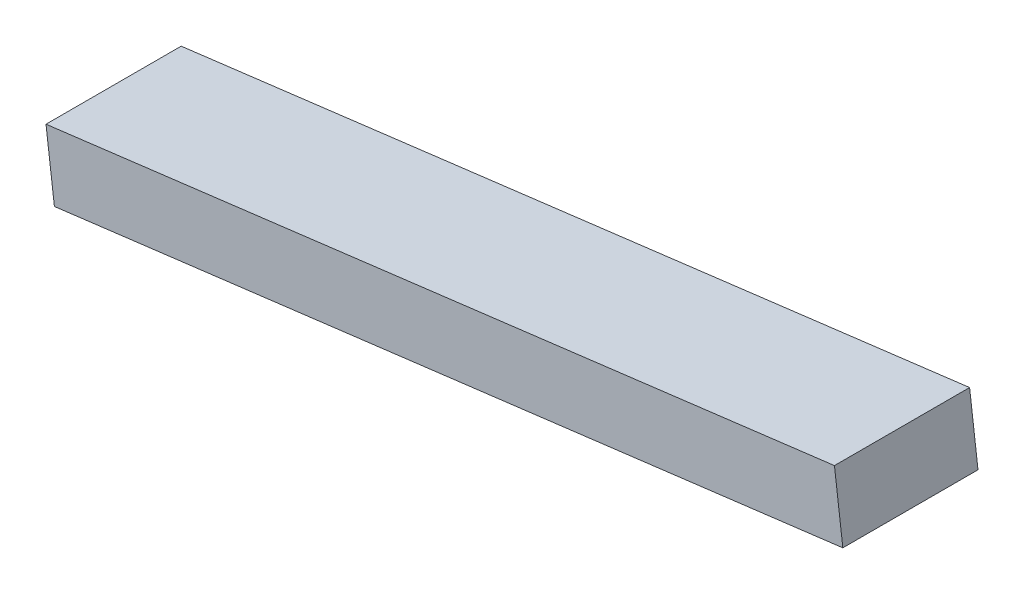
ISO-10303-21;
HEADER;
FILE_DESCRIPTION(('STEP AP214'),'2;1');
FILE_NAME('part.step','',(''),(''),'','','');
FILE_SCHEMA(('AUTOMOTIVE_DESIGN { 1 0 10303 214 1 1 1 1 }'));
ENDSEC;
DATA;
#1=APPLICATION_CONTEXT('core data for automotive mechanical design processes');
#2=APPLICATION_PROTOCOL_DEFINITION('international standard','automotive_design',2000,#1);
#3=PRODUCT_CONTEXT('',#1,'mechanical');
#4=PRODUCT('Part','Part','',(#3));
#5=PRODUCT_RELATED_PRODUCT_CATEGORY('part','',(#4));
#6=PRODUCT_DEFINITION_FORMATION('','',#4);
#7=PRODUCT_DEFINITION_CONTEXT('part definition',#1,'design');
#8=PRODUCT_DEFINITION('design','',#6,#7);
#9=PRODUCT_DEFINITION_SHAPE('','',#8);
#10=(LENGTH_UNIT() NAMED_UNIT(*) SI_UNIT(.MILLI.,.METRE.));
#11=(NAMED_UNIT(*) PLANE_ANGLE_UNIT() SI_UNIT($,.RADIAN.));
#12=(NAMED_UNIT(*) SI_UNIT($,.STERADIAN.) SOLID_ANGLE_UNIT());
#13=UNCERTAINTY_MEASURE_WITH_UNIT(LENGTH_MEASURE(1.E-05),#10,'distance_accuracy_value','');
#14=(GEOMETRIC_REPRESENTATION_CONTEXT(3) GLOBAL_UNCERTAINTY_ASSIGNED_CONTEXT((#13)) GLOBAL_UNIT_ASSIGNED_CONTEXT((#10,
#11,#12)) REPRESENTATION_CONTEXT('',''));
#15=CARTESIAN_POINT('',(0.,0.,0.));
#16=DIRECTION('',(0.,0.,1.));
#17=DIRECTION('',(1.,0.,0.));
#18=AXIS2_PLACEMENT_3D('',#15,#16,#17);
#19=CARTESIAN_POINT('',(368.571015472579,25.8277068433039,636.696489798407));
#20=DIRECTION('',(0.124068164170064,-0.992273697444143,0.));
#21=DIRECTION('',(0.992273697444143,0.124068164170064,0.));
#22=AXIS2_PLACEMENT_3D('',#19,#20,#21);
#23=PLANE('',#22);
#24=DIRECTION('',(-0.992273697444143,-0.124068164170064,0.));
#25=VECTOR('',#24,1.);
#26=CARTESIAN_POINT('',(368.571015472579,25.8277068433039,636.696489798407));
#27=LINE('',#26,#25);
#28=CARTESIAN_POINT('',(367.562865395976,25.7016535885072,636.696489798407));
#29=VERTEX_POINT('',#28);
#30=CARTESIAN_POINT('',(293.480518874116,16.4388254453726,636.696489798407));
#31=VERTEX_POINT('',#30);
#32=EDGE_CURVE('E87',#29,#31,#27,.T.);
#33=ORIENTED_EDGE('',*,*,#32,.T.);
#34=DIRECTION('',(0.,0.,1.));
#35=VECTOR('',#34,1.);
#36=CARTESIAN_POINT('',(293.480518874116,16.4388254453726,636.696489798407));
#37=LINE('',#36,#35);
#38=CARTESIAN_POINT('',(293.480518874116,16.4388254453726,649.396489798407));
#39=VERTEX_POINT('',#38);
#40=EDGE_CURVE('E43',#31,#39,#37,.T.);
#41=ORIENTED_EDGE('',*,*,#40,.T.);
#42=DIRECTION('',(-0.992273697444143,-0.124068164170064,0.));
#43=VECTOR('',#42,1.);
#44=CARTESIAN_POINT('',(368.571015472579,25.8277068433039,649.396489798407));
#45=LINE('',#44,#43);
#46=CARTESIAN_POINT('',(367.562865395976,25.7016535885072,649.396489798407));
#47=VERTEX_POINT('',#46);
#48=EDGE_CURVE('E78',#47,#39,#45,.T.);
#49=ORIENTED_EDGE('',*,*,#48,.F.);
#50=DIRECTION('',(0.,0.,1.));
#51=VECTOR('',#50,1.);
#52=CARTESIAN_POINT('',(367.562865395976,25.7016535885072,636.696489798407));
#53=LINE('',#52,#51);
#54=EDGE_CURVE('E91',#29,#47,#53,.T.);
#55=ORIENTED_EDGE('',*,*,#54,.F.);
#56=EDGE_LOOP('',(#33,#41,#49,#55));
#57=FACE_BOUND('',#56,.T.);
#58=ADVANCED_FACE('F35',(#57),#23,.F.);
#59=CARTESIAN_POINT('',(293.480518874116,16.4388254453726,636.696489798407));
#60=DIRECTION('',(0.992273697444144,0.124068164170055,0.));
#61=DIRECTION('',(-0.124068164170055,0.992273697444144,0.));
#62=AXIS2_PLACEMENT_3D('',#59,#60,#61);
#63=PLANE('',#62);
#64=DIRECTION('',(0.124068164170055,-0.992273697444144,0.));
#65=VECTOR('',#64,1.);
#66=CARTESIAN_POINT('',(293.480518874116,16.4388254453726,649.396489798407));
#67=LINE('',#66,#65);
#68=CARTESIAN_POINT('',(294.268351716596,10.1378874666023,649.396489798407));
#69=VERTEX_POINT('',#68);
#70=EDGE_CURVE('E70',#39,#69,#67,.T.);
#71=ORIENTED_EDGE('',*,*,#70,.F.);
#72=ORIENTED_EDGE('',*,*,#40,.F.);
#73=DIRECTION('',(0.124068164170055,-0.992273697444144,0.));
#74=VECTOR('',#73,1.);
#75=CARTESIAN_POINT('',(293.480518874116,16.4388254453726,636.696489798407));
#76=LINE('',#75,#74);
#77=CARTESIAN_POINT('',(294.268351716596,10.1378874666023,636.696489798407));
#78=VERTEX_POINT('',#77);
#79=EDGE_CURVE('E57',#31,#78,#76,.T.);
#80=ORIENTED_EDGE('',*,*,#79,.T.);
#81=DIRECTION('',(0.,0.,1.));
#82=VECTOR('',#81,1.);
#83=CARTESIAN_POINT('',(294.268351716596,10.1378874666023,636.696489798407));
#84=LINE('',#83,#82);
#85=EDGE_CURVE('E76',#78,#69,#84,.T.);
#86=ORIENTED_EDGE('',*,*,#85,.T.);
#87=EDGE_LOOP('',(#71,#72,#80,#86));
#88=FACE_BOUND('',#87,.T.);
#89=ADVANCED_FACE('F72',(#88),#63,.F.);
#90=CARTESIAN_POINT('',(369.358848315059,19.5267688645336,636.696489798407));
#91=DIRECTION('',(0.124068164170064,-0.992273697444143,0.));
#92=DIRECTION('',(0.992273697444143,0.124068164170064,0.));
#93=AXIS2_PLACEMENT_3D('',#90,#91,#92);
#94=PLANE('',#93);
#95=DIRECTION('',(0.,0.,1.));
#96=VECTOR('',#95,1.);
#97=CARTESIAN_POINT('',(368.350698238456,19.4007156097369,649.396489798407));
#98=LINE('',#97,#96);
#99=CARTESIAN_POINT('',(368.350698238456,19.4007156097369,636.696489798407));
#100=VERTEX_POINT('',#99);
#101=CARTESIAN_POINT('',(368.350698238456,19.4007156097369,649.396489798407));
#102=VERTEX_POINT('',#101);
#103=EDGE_CURVE('E99',#100,#102,#98,.T.);
#104=ORIENTED_EDGE('',*,*,#103,.T.);
#105=DIRECTION('',(-0.992273697444143,-0.124068164170064,0.));
#106=VECTOR('',#105,1.);
#107=CARTESIAN_POINT('',(369.358848315059,19.5267688645336,649.396489798407));
#108=LINE('',#107,#106);
#109=EDGE_CURVE('E79',#102,#69,#108,.T.);
#110=ORIENTED_EDGE('',*,*,#109,.T.);
#111=ORIENTED_EDGE('',*,*,#85,.F.);
#112=DIRECTION('',(-0.992273697444143,-0.124068164170064,0.));
#113=VECTOR('',#112,1.);
#114=CARTESIAN_POINT('',(369.358848315059,19.5267688645336,636.696489798407));
#115=LINE('',#114,#113);
#116=EDGE_CURVE('E85',#100,#78,#115,.T.);
#117=ORIENTED_EDGE('',*,*,#116,.F.);
#118=EDGE_LOOP('',(#104,#110,#111,#117));
#119=FACE_BOUND('',#118,.T.);
#120=ADVANCED_FACE('F37',(#119),#94,.T.);
#121=CARTESIAN_POINT('',(0.,0.,636.696489798407));
#122=DIRECTION('',(0.,0.,1.));
#123=DIRECTION('',(-1.,0.,0.));
#124=AXIS2_PLACEMENT_3D('',#121,#122,#123);
#125=PLANE('',#124);
#126=ORIENTED_EDGE('',*,*,#116,.T.);
#127=ORIENTED_EDGE('',*,*,#79,.F.);
#128=ORIENTED_EDGE('',*,*,#32,.F.);
#129=DIRECTION('',(0.124068164170064,-0.992273697444143,0.));
#130=VECTOR('',#129,1.);
#131=CARTESIAN_POINT('',(366.407004187999,34.9460127860834,636.696489798407));
#132=LINE('',#131,#130);
#133=EDGE_CURVE('E96',#29,#100,#132,.T.);
#134=ORIENTED_EDGE('',*,*,#133,.T.);
#135=EDGE_LOOP('',(#126,#127,#128,#134));
#136=FACE_BOUND('',#135,.T.);
#137=ADVANCED_FACE('F109',(#136),#125,.F.);
#138=CARTESIAN_POINT('',(0.,0.,649.396489798407));
#139=DIRECTION('',(0.,0.,1.));
#140=DIRECTION('',(-1.,0.,0.));
#141=AXIS2_PLACEMENT_3D('',#138,#139,#140);
#142=PLANE('',#141);
#143=DIRECTION('',(-0.124068164170064,0.992273697444143,0.));
#144=VECTOR('',#143,1.);
#145=CARTESIAN_POINT('',(365.06912320032,45.6461317349273,649.396489798407));
#146=LINE('',#145,#144);
#147=EDGE_CURVE('E11',#102,#47,#146,.T.);
#148=ORIENTED_EDGE('',*,*,#147,.T.);
#149=ORIENTED_EDGE('',*,*,#48,.T.);
#150=ORIENTED_EDGE('',*,*,#70,.T.);
#151=ORIENTED_EDGE('',*,*,#109,.F.);
#152=EDGE_LOOP('',(#148,#149,#150,#151));
#153=FACE_BOUND('',#152,.T.);
#154=ADVANCED_FACE('F82',(#153),#142,.T.);
#155=CARTESIAN_POINT('',(366.407004187999,34.9460127860834,649.396489798407));
#156=DIRECTION('',(-0.992273697444143,-0.124068164170064,0.));
#157=DIRECTION('',(0.124068164170064,-0.992273697444143,0.));
#158=AXIS2_PLACEMENT_3D('',#155,#156,#157);
#159=PLANE('',#158);
#160=ORIENTED_EDGE('',*,*,#133,.F.);
#161=ORIENTED_EDGE('',*,*,#54,.T.);
#162=ORIENTED_EDGE('',*,*,#147,.F.);
#163=ORIENTED_EDGE('',*,*,#103,.F.);
#164=EDGE_LOOP('',(#160,#161,#162,#163));
#165=FACE_BOUND('',#164,.T.);
#166=ADVANCED_FACE('F105',(#165),#159,.F.);
#167=CLOSED_SHELL('',(#58,#89,#120,#137,#154,#166));
#168=MANIFOLD_SOLID_BREP('B2',#167);
#169=ADVANCED_BREP_SHAPE_REPRESENTATION('',(#18,#168),#14);
#170=SHAPE_DEFINITION_REPRESENTATION(#9,#169);
ENDSEC;
END-ISO-10303-21;
